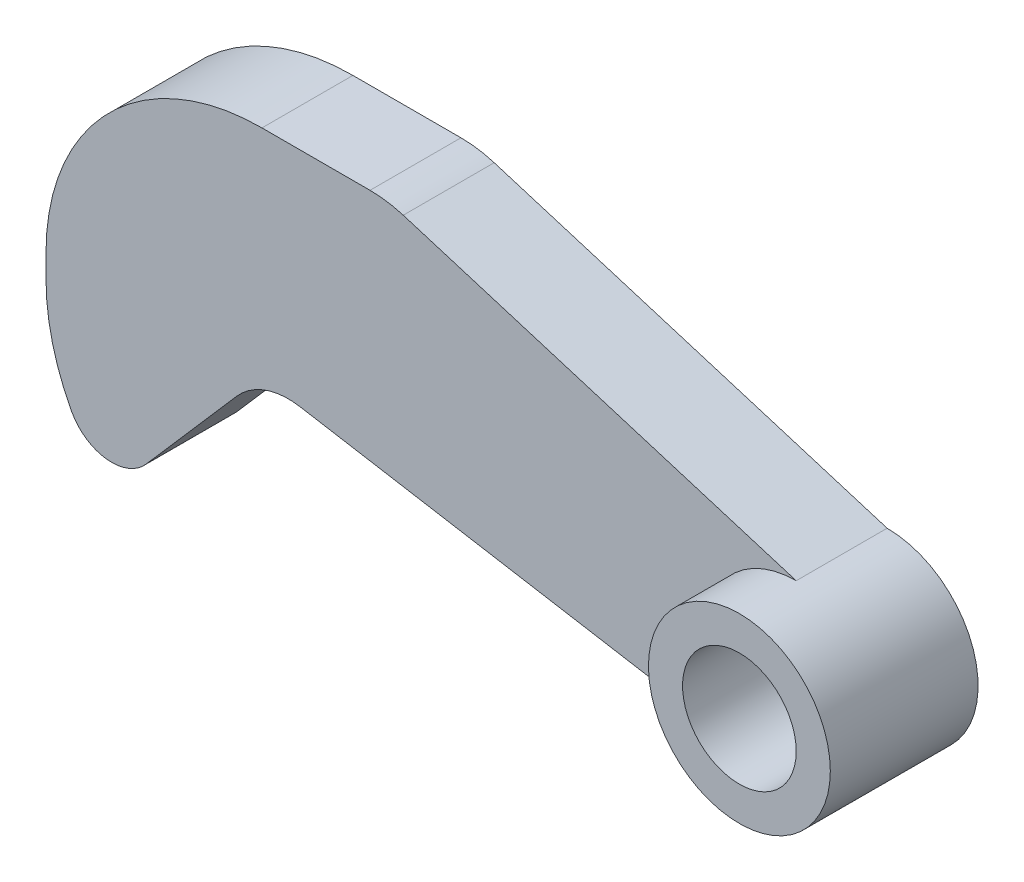
ISO-10303-21;
HEADER;
FILE_DESCRIPTION(('STEP AP214'),'2;1');
FILE_NAME('part.step','',(''),(''),'','','');
FILE_SCHEMA(('AUTOMOTIVE_DESIGN { 1 0 10303 214 1 1 1 1 }'));
ENDSEC;
DATA;
#1=APPLICATION_CONTEXT('core data for automotive mechanical design processes');
#2=APPLICATION_PROTOCOL_DEFINITION('international standard','automotive_design',2000,#1);
#3=PRODUCT_CONTEXT('',#1,'mechanical');
#4=PRODUCT('Part','Part','',(#3));
#5=PRODUCT_RELATED_PRODUCT_CATEGORY('part','',(#4));
#6=PRODUCT_DEFINITION_FORMATION('','',#4);
#7=PRODUCT_DEFINITION_CONTEXT('part definition',#1,'design');
#8=PRODUCT_DEFINITION('design','',#6,#7);
#9=PRODUCT_DEFINITION_SHAPE('','',#8);
#10=(LENGTH_UNIT() NAMED_UNIT(*) SI_UNIT(.MILLI.,.METRE.));
#11=(NAMED_UNIT(*) PLANE_ANGLE_UNIT() SI_UNIT($,.RADIAN.));
#12=(NAMED_UNIT(*) SI_UNIT($,.STERADIAN.) SOLID_ANGLE_UNIT());
#13=UNCERTAINTY_MEASURE_WITH_UNIT(LENGTH_MEASURE(1.E-05),#10,'distance_accuracy_value','');
#14=(GEOMETRIC_REPRESENTATION_CONTEXT(3) GLOBAL_UNCERTAINTY_ASSIGNED_CONTEXT((#13)) GLOBAL_UNIT_ASSIGNED_CONTEXT((#10,
#11,#12)) REPRESENTATION_CONTEXT('',''));
#15=CARTESIAN_POINT('',(0.,0.,0.));
#16=DIRECTION('',(0.,0.,1.));
#17=DIRECTION('',(1.,0.,0.));
#18=AXIS2_PLACEMENT_3D('',#15,#16,#17);
#19=CARTESIAN_POINT('',(25.,0.499999999999999,4.));
#20=DIRECTION('',(0.,0.,-1.));
#21=DIRECTION('',(-1.,0.,0.));
#22=AXIS2_PLACEMENT_3D('',#19,#20,#21);
#23=CYLINDRICAL_SURFACE('',#22,4.);
#24=CARTESIAN_POINT('',(25.,0.499999999999999,0.));
#25=DIRECTION('',(0.,0.,1.));
#26=DIRECTION('',(1.,0.,0.));
#27=AXIS2_PLACEMENT_3D('',#24,#25,#26);
#28=CIRCLE('',#27,4.);
#29=CARTESIAN_POINT('',(23.6766388033441,-3.27474703035655,0.));
#30=VERTEX_POINT('',#29);
#31=CARTESIAN_POINT('',(25.,4.5,0.));
#32=VERTEX_POINT('',#31);
#33=EDGE_CURVE('E151',#30,#32,#28,.T.);
#34=ORIENTED_EDGE('',*,*,#33,.T.);
#35=DIRECTION('',(0.,0.,-1.));
#36=VECTOR('',#35,1.);
#37=CARTESIAN_POINT('',(25.,4.5,4.));
#38=LINE('',#37,#36);
#39=CARTESIAN_POINT('',(25.,4.5,4.));
#40=VERTEX_POINT('',#39);
#41=EDGE_CURVE('E11',#40,#32,#38,.T.);
#42=ORIENTED_EDGE('',*,*,#41,.F.);
#43=CARTESIAN_POINT('',(25.,0.499999999999996,4.));
#44=DIRECTION('',(0.,0.,1.));
#45=DIRECTION('',(1.,0.,0.));
#46=AXIS2_PLACEMENT_3D('',#43,#44,#45);
#47=CIRCLE('',#46,4.);
#48=CARTESIAN_POINT('',(23.6766388033441,-3.27474703035655,4.));
#49=VERTEX_POINT('',#48);
#50=EDGE_CURVE('E195',#40,#49,#47,.T.);
#51=ORIENTED_EDGE('',*,*,#50,.T.);
#52=DIRECTION('',(0.,0.,-1.));
#53=VECTOR('',#52,1.);
#54=CARTESIAN_POINT('',(23.6766388033441,-3.27474703035655,4.));
#55=LINE('',#54,#53);
#56=EDGE_CURVE('E147',#49,#30,#55,.T.);
#57=ORIENTED_EDGE('',*,*,#56,.T.);
#58=EDGE_LOOP('',(#34,#42,#51,#57));
#59=FACE_BOUND('',#58,.T.);
#60=CARTESIAN_POINT('',(25.,0.499999999999996,6.5));
#61=DIRECTION('',(0.,0.,1.));
#62=DIRECTION('',(1.,0.,0.));
#63=AXIS2_PLACEMENT_3D('',#60,#61,#62);
#64=CIRCLE('',#63,4.);
#65=CARTESIAN_POINT('',(29.,0.499999999999996,6.5));
#66=VERTEX_POINT('',#65);
#67=EDGE_CURVE('E155',#66,#66,#64,.T.);
#68=ORIENTED_EDGE('',*,*,#67,.F.);
#69=EDGE_LOOP('',(#68));
#70=FACE_BOUND('',#69,.T.);
#71=ADVANCED_FACE('F35',(#59,#70),#23,.T.);
#72=CARTESIAN_POINT('',(3.3923782639379,11.1023288637968,4.));
#73=DIRECTION('',(-0.29221853559902,-0.956351571051339,0.));
#74=DIRECTION('',(0.956351571051339,-0.29221853559902,0.));
#75=AXIS2_PLACEMENT_3D('',#72,#73,#74);
#76=PLANE('',#75);
#77=DIRECTION('',(-0.956351571051339,0.29221853559902,0.));
#78=VECTOR('',#77,1.);
#79=CARTESIAN_POINT('',(3.3923782639379,11.1023288637968,0.));
#80=LINE('',#79,#78);
#81=CARTESIAN_POINT('',(7.71424701915991,9.78175785525669,0.));
#82=VERTEX_POINT('',#81);
#83=EDGE_CURVE('E154',#32,#82,#80,.T.);
#84=ORIENTED_EDGE('',*,*,#83,.T.);
#85=DIRECTION('',(0.,0.,-1.));
#86=VECTOR('',#85,1.);
#87=CARTESIAN_POINT('',(7.71424701915991,9.78175785525669,4.));
#88=LINE('',#87,#86);
#89=CARTESIAN_POINT('',(7.71424701915991,9.78175785525669,4.));
#90=VERTEX_POINT('',#89);
#91=EDGE_CURVE('E44',#90,#82,#88,.T.);
#92=ORIENTED_EDGE('',*,*,#91,.F.);
#93=DIRECTION('',(-0.956351571051339,0.29221853559902,0.));
#94=VECTOR('',#93,1.);
#95=CARTESIAN_POINT('',(3.3923782639379,11.1023288637968,4.));
#96=LINE('',#95,#94);
#97=EDGE_CURVE('E105',#40,#90,#96,.T.);
#98=ORIENTED_EDGE('',*,*,#97,.F.);
#99=ORIENTED_EDGE('',*,*,#41,.T.);
#100=EDGE_LOOP('',(#84,#92,#98,#99));
#101=FACE_BOUND('',#100,.T.);
#102=ADVANCED_FACE('F242',(#101),#76,.F.);
#103=CARTESIAN_POINT('',(6.25315434116481,5.,4.));
#104=DIRECTION('',(0.,0.,-1.));
#105=DIRECTION('',(-1.,0.,0.));
#106=AXIS2_PLACEMENT_3D('',#103,#104,#105);
#107=CYLINDRICAL_SURFACE('',#106,5.);
#108=CARTESIAN_POINT('',(6.25315434116481,5.,0.));
#109=DIRECTION('',(0.,0.,1.));
#110=DIRECTION('',(1.,0.,0.));
#111=AXIS2_PLACEMENT_3D('',#108,#109,#110);
#112=CIRCLE('',#111,5.);
#113=CARTESIAN_POINT('',(6.25315434116481,10.,0.));
#114=VERTEX_POINT('',#113);
#115=EDGE_CURVE('E158',#114,#82,#112,.F.);
#116=ORIENTED_EDGE('',*,*,#115,.F.);
#117=DIRECTION('',(0.,0.,-1.));
#118=VECTOR('',#117,1.);
#119=CARTESIAN_POINT('',(6.25315434116481,10.,4.));
#120=LINE('',#119,#118);
#121=CARTESIAN_POINT('',(6.25315434116481,10.,4.));
#122=VERTEX_POINT('',#121);
#123=EDGE_CURVE('E189',#122,#114,#120,.T.);
#124=ORIENTED_EDGE('',*,*,#123,.F.);
#125=CARTESIAN_POINT('',(6.25315434116481,5.,4.));
#126=DIRECTION('',(0.,0.,1.));
#127=DIRECTION('',(1.,0.,0.));
#128=AXIS2_PLACEMENT_3D('',#125,#126,#127);
#129=CIRCLE('',#128,5.);
#130=EDGE_CURVE('E201',#122,#90,#129,.F.);
#131=ORIENTED_EDGE('',*,*,#130,.T.);
#132=ORIENTED_EDGE('',*,*,#91,.T.);
#133=EDGE_LOOP('',(#116,#124,#131,#132));
#134=FACE_BOUND('',#133,.T.);
#135=ADVANCED_FACE('F246',(#134),#107,.T.);
#136=CARTESIAN_POINT('',(0.,10.,4.));
#137=DIRECTION('',(0.,1.,0.));
#138=DIRECTION('',(-1.,0.,0.));
#139=AXIS2_PLACEMENT_3D('',#136,#137,#138);
#140=PLANE('',#139);
#141=DIRECTION('',(1.,0.,0.));
#142=VECTOR('',#141,1.);
#143=CARTESIAN_POINT('',(0.,10.,0.));
#144=LINE('',#143,#142);
#145=CARTESIAN_POINT('',(1.5,10.,0.));
#146=VERTEX_POINT('',#145);
#147=EDGE_CURVE('E161',#146,#114,#144,.T.);
#148=ORIENTED_EDGE('',*,*,#147,.F.);
#149=DIRECTION('',(0.,0.,-1.));
#150=VECTOR('',#149,1.);
#151=CARTESIAN_POINT('',(1.5,10.,4.));
#152=LINE('',#151,#150);
#153=CARTESIAN_POINT('',(1.5,10.,4.));
#154=VERTEX_POINT('',#153);
#155=EDGE_CURVE('E187',#154,#146,#152,.T.);
#156=ORIENTED_EDGE('',*,*,#155,.F.);
#157=DIRECTION('',(1.,0.,0.));
#158=VECTOR('',#157,1.);
#159=CARTESIAN_POINT('',(0.,10.,4.));
#160=LINE('',#159,#158);
#161=EDGE_CURVE('E204',#154,#122,#160,.T.);
#162=ORIENTED_EDGE('',*,*,#161,.T.);
#163=ORIENTED_EDGE('',*,*,#123,.T.);
#164=EDGE_LOOP('',(#148,#156,#162,#163));
#165=FACE_BOUND('',#164,.T.);
#166=ADVANCED_FACE('F251',(#165),#140,.T.);
#167=CARTESIAN_POINT('',(1.5,0.499999999999999,4.));
#168=DIRECTION('',(0.,0.,-1.));
#169=DIRECTION('',(-1.,0.,0.));
#170=AXIS2_PLACEMENT_3D('',#167,#168,#169);
#171=CYLINDRICAL_SURFACE('',#170,9.5);
#172=CARTESIAN_POINT('',(1.5,0.499999999999999,0.));
#173=DIRECTION('',(0.,0.,1.));
#174=DIRECTION('',(1.,0.,0.));
#175=AXIS2_PLACEMENT_3D('',#172,#173,#174);
#176=CIRCLE('',#175,9.5);
#177=CARTESIAN_POINT('',(-8.,0.499999999999999,0.));
#178=VERTEX_POINT('',#177);
#179=EDGE_CURVE('E164',#178,#146,#176,.F.);
#180=ORIENTED_EDGE('',*,*,#179,.F.);
#181=DIRECTION('',(0.,0.,-1.));
#182=VECTOR('',#181,1.);
#183=CARTESIAN_POINT('',(-8.,0.499999999999999,4.));
#184=LINE('',#183,#182);
#185=CARTESIAN_POINT('',(-8.,0.499999999999999,4.));
#186=VERTEX_POINT('',#185);
#187=EDGE_CURVE('E185',#186,#178,#184,.T.);
#188=ORIENTED_EDGE('',*,*,#187,.F.);
#189=CARTESIAN_POINT('',(1.5,0.499999999999999,4.));
#190=DIRECTION('',(0.,0.,1.));
#191=DIRECTION('',(1.,0.,0.));
#192=AXIS2_PLACEMENT_3D('',#189,#190,#191);
#193=CIRCLE('',#192,9.5);
#194=EDGE_CURVE('E207',#186,#154,#193,.F.);
#195=ORIENTED_EDGE('',*,*,#194,.T.);
#196=ORIENTED_EDGE('',*,*,#155,.T.);
#197=EDGE_LOOP('',(#180,#188,#195,#196));
#198=FACE_BOUND('',#197,.T.);
#199=ADVANCED_FACE('F257',(#198),#171,.T.);
#200=CARTESIAN_POINT('',(-8.,0.,4.));
#201=DIRECTION('',(-1.,0.,0.));
#202=DIRECTION('',(0.,0.,1.));
#203=AXIS2_PLACEMENT_3D('',#200,#201,#202);
#204=PLANE('',#203);
#205=DIRECTION('',(0.,1.,0.));
#206=VECTOR('',#205,1.);
#207=CARTESIAN_POINT('',(-8.,0.,0.));
#208=LINE('',#207,#206);
#209=CARTESIAN_POINT('',(-8.,-0.500000000000004,0.));
#210=VERTEX_POINT('',#209);
#211=EDGE_CURVE('E167',#210,#178,#208,.T.);
#212=ORIENTED_EDGE('',*,*,#211,.F.);
#213=DIRECTION('',(0.,0.,-1.));
#214=VECTOR('',#213,1.);
#215=CARTESIAN_POINT('',(-8.,-0.500000000000004,4.));
#216=LINE('',#215,#214);
#217=CARTESIAN_POINT('',(-8.,-0.500000000000004,4.));
#218=VERTEX_POINT('',#217);
#219=EDGE_CURVE('E183',#218,#210,#216,.T.);
#220=ORIENTED_EDGE('',*,*,#219,.F.);
#221=DIRECTION('',(0.,1.,0.));
#222=VECTOR('',#221,1.);
#223=CARTESIAN_POINT('',(-8.,0.,4.));
#224=LINE('',#223,#222);
#225=EDGE_CURVE('E210',#218,#186,#224,.T.);
#226=ORIENTED_EDGE('',*,*,#225,.T.);
#227=ORIENTED_EDGE('',*,*,#187,.T.);
#228=EDGE_LOOP('',(#212,#220,#226,#227));
#229=FACE_BOUND('',#228,.T.);
#230=ADVANCED_FACE('F261',(#229),#204,.T.);
#231=CARTESIAN_POINT('',(1.5,-0.500000000000004,4.));
#232=DIRECTION('',(0.,0.,-1.));
#233=DIRECTION('',(-1.,0.,0.));
#234=AXIS2_PLACEMENT_3D('',#231,#232,#233);
#235=CYLINDRICAL_SURFACE('',#234,9.5);
#236=CARTESIAN_POINT('',(1.5,-0.500000000000004,0.));
#237=DIRECTION('',(0.,0.,1.));
#238=DIRECTION('',(1.,0.,0.));
#239=AXIS2_PLACEMENT_3D('',#236,#237,#238);
#240=CIRCLE('',#239,9.5);
#241=CARTESIAN_POINT('',(-6.87096620528538,-4.99187319388806,0.));
#242=VERTEX_POINT('',#241);
#243=EDGE_CURVE('E170',#242,#210,#240,.F.);
#244=ORIENTED_EDGE('',*,*,#243,.F.);
#245=DIRECTION('',(0.,0.,-1.));
#246=VECTOR('',#245,1.);
#247=CARTESIAN_POINT('',(-6.87096620528538,-4.99187319388806,4.));
#248=LINE('',#247,#246);
#249=CARTESIAN_POINT('',(-6.87096620528538,-4.99187319388806,4.));
#250=VERTEX_POINT('',#249);
#251=EDGE_CURVE('E181',#250,#242,#248,.T.);
#252=ORIENTED_EDGE('',*,*,#251,.F.);
#253=CARTESIAN_POINT('',(1.5,-0.500000000000004,4.));
#254=DIRECTION('',(0.,0.,1.));
#255=DIRECTION('',(1.,0.,0.));
#256=AXIS2_PLACEMENT_3D('',#253,#254,#255);
#257=CIRCLE('',#256,9.5);
#258=EDGE_CURVE('E213',#250,#218,#257,.F.);
#259=ORIENTED_EDGE('',*,*,#258,.T.);
#260=ORIENTED_EDGE('',*,*,#219,.T.);
#261=EDGE_LOOP('',(#244,#252,#259,#260));
#262=FACE_BOUND('',#261,.T.);
#263=ADVANCED_FACE('F265',(#262),#235,.T.);
#264=CARTESIAN_POINT('',(-5.10865753048846,-4.04621567938531,4.));
#265=DIRECTION('',(0.,0.,-1.));
#266=DIRECTION('',(-1.,0.,0.));
#267=AXIS2_PLACEMENT_3D('',#264,#265,#266);
#268=CYLINDRICAL_SURFACE('',#267,2.);
#269=CARTESIAN_POINT('',(-5.10865753048846,-4.04621567938531,0.));
#270=DIRECTION('',(0.,0.,1.));
#271=DIRECTION('',(1.,0.,0.));
#272=AXIS2_PLACEMENT_3D('',#269,#270,#271);
#273=CIRCLE('',#272,2.);
#274=CARTESIAN_POINT('',(-3.60008860757994,-5.35931118422669,0.));
#275=VERTEX_POINT('',#274);
#276=EDGE_CURVE('E173',#275,#242,#273,.F.);
#277=ORIENTED_EDGE('',*,*,#276,.F.);
#278=DIRECTION('',(0.,0.,-1.));
#279=VECTOR('',#278,1.);
#280=CARTESIAN_POINT('',(-3.60008860757994,-5.35931118422669,4.));
#281=LINE('',#280,#279);
#282=CARTESIAN_POINT('',(-3.60008860757994,-5.35931118422669,4.));
#283=VERTEX_POINT('',#282);
#284=EDGE_CURVE('E142',#283,#275,#281,.T.);
#285=ORIENTED_EDGE('',*,*,#284,.F.);
#286=CARTESIAN_POINT('',(-5.10865753048846,-4.04621567938531,4.));
#287=DIRECTION('',(0.,0.,1.));
#288=DIRECTION('',(1.,0.,0.));
#289=AXIS2_PLACEMENT_3D('',#286,#287,#288);
#290=CIRCLE('',#289,2.);
#291=EDGE_CURVE('E135',#283,#250,#290,.F.);
#292=ORIENTED_EDGE('',*,*,#291,.T.);
#293=ORIENTED_EDGE('',*,*,#251,.T.);
#294=EDGE_LOOP('',(#277,#285,#292,#293));
#295=FACE_BOUND('',#294,.T.);
#296=ADVANCED_FACE('F217',(#295),#268,.T.);
#297=CARTESIAN_POINT('',(0.605805689260192,-0.527308176176137,4.));
#298=DIRECTION('',(-0.754284461454259,0.656547752420689,0.));
#299=DIRECTION('',(-0.656547752420689,-0.754284461454259,0.));
#300=AXIS2_PLACEMENT_3D('',#297,#298,#299);
#301=PLANE('',#300);
#302=DIRECTION('',(0.656547752420689,0.754284461454259,0.));
#303=VECTOR('',#302,1.);
#304=CARTESIAN_POINT('',(0.605805689260192,-0.527308176176137,0.));
#305=LINE('',#304,#303);
#306=CARTESIAN_POINT('',(0.394172841763696,-0.770445659796126,0.));
#307=VERTEX_POINT('',#306);
#308=EDGE_CURVE('E141',#275,#307,#305,.T.);
#309=ORIENTED_EDGE('',*,*,#308,.T.);
#310=DIRECTION('',(0.,0.,-1.));
#311=VECTOR('',#310,1.);
#312=CARTESIAN_POINT('',(0.394172841763696,-0.770445659796126,4.));
#313=LINE('',#312,#311);
#314=CARTESIAN_POINT('',(0.394172841763696,-0.770445659796126,4.));
#315=VERTEX_POINT('',#314);
#316=EDGE_CURVE('E138',#315,#307,#313,.T.);
#317=ORIENTED_EDGE('',*,*,#316,.F.);
#318=DIRECTION('',(0.656547752420689,0.754284461454259,0.));
#319=VECTOR('',#318,1.);
#320=CARTESIAN_POINT('',(0.605805689260192,-0.527308176176137,4.));
#321=LINE('',#320,#319);
#322=EDGE_CURVE('E128',#283,#315,#321,.T.);
#323=ORIENTED_EDGE('',*,*,#322,.F.);
#324=ORIENTED_EDGE('',*,*,#284,.T.);
#325=EDGE_LOOP('',(#309,#317,#323,#324));
#326=FACE_BOUND('',#325,.T.);
#327=ADVANCED_FACE('F139',(#326),#301,.F.);
#328=CARTESIAN_POINT('',(2.65702622612648,-2.74008891705818,4.));
#329=DIRECTION('',(0.,0.,-1.));
#330=DIRECTION('',(-1.,0.,0.));
#331=AXIS2_PLACEMENT_3D('',#328,#329,#330);
#332=CYLINDRICAL_SURFACE('',#331,3.);
#333=CARTESIAN_POINT('',(2.65702622612648,-2.74008891705818,0.));
#334=DIRECTION('',(0.,0.,1.));
#335=DIRECTION('',(1.,0.,0.));
#336=AXIS2_PLACEMENT_3D('',#333,#334,#335);
#337=CIRCLE('',#336,3.);
#338=CARTESIAN_POINT('',(3.16042427027158,0.217374592294197,0.));
#339=VERTEX_POINT('',#338);
#340=EDGE_CURVE('E92',#307,#339,#337,.F.);
#341=ORIENTED_EDGE('',*,*,#340,.T.);
#342=DIRECTION('',(0.,0.,-1.));
#343=VECTOR('',#342,1.);
#344=CARTESIAN_POINT('',(3.16042427027158,0.217374592294197,4.));
#345=LINE('',#344,#343);
#346=CARTESIAN_POINT('',(3.16042427027158,0.217374592294197,4.));
#347=VERTEX_POINT('',#346);
#348=EDGE_CURVE('E143',#347,#339,#345,.T.);
#349=ORIENTED_EDGE('',*,*,#348,.F.);
#350=CARTESIAN_POINT('',(2.65702622612648,-2.74008891705818,4.));
#351=DIRECTION('',(0.,0.,1.));
#352=DIRECTION('',(1.,0.,0.));
#353=AXIS2_PLACEMENT_3D('',#350,#351,#352);
#354=CIRCLE('',#353,3.);
#355=EDGE_CURVE('E132',#315,#347,#354,.F.);
#356=ORIENTED_EDGE('',*,*,#355,.F.);
#357=ORIENTED_EDGE('',*,*,#316,.T.);
#358=EDGE_LOOP('',(#341,#349,#356,#357));
#359=FACE_BOUND('',#358,.T.);
#360=ADVANCED_FACE('F145',(#359),#332,.F.);
#361=CARTESIAN_POINT('',(0.124945006599214,0.73405191377036,4.));
#362=DIRECTION('',(0.167799348048367,0.985821169784126,0.));
#363=DIRECTION('',(-0.985821169784126,0.167799348048367,0.));
#364=AXIS2_PLACEMENT_3D('',#361,#362,#363);
#365=PLANE('',#364);
#366=DIRECTION('',(0.985821169784126,-0.167799348048367,0.));
#367=VECTOR('',#366,1.);
#368=CARTESIAN_POINT('',(0.124945006599214,0.73405191377036,0.));
#369=LINE('',#368,#367);
#370=EDGE_CURVE('E98',#339,#30,#369,.T.);
#371=ORIENTED_EDGE('',*,*,#370,.T.);
#372=ORIENTED_EDGE('',*,*,#56,.F.);
#373=DIRECTION('',(0.985821169784126,-0.167799348048367,0.));
#374=VECTOR('',#373,1.);
#375=CARTESIAN_POINT('',(0.124945006599214,0.73405191377036,4.));
#376=LINE('',#375,#374);
#377=EDGE_CURVE('E53',#347,#49,#376,.T.);
#378=ORIENTED_EDGE('',*,*,#377,.F.);
#379=ORIENTED_EDGE('',*,*,#348,.T.);
#380=EDGE_LOOP('',(#371,#372,#378,#379));
#381=FACE_BOUND('',#380,.T.);
#382=ADVANCED_FACE('F231',(#381),#365,.F.);
#383=CARTESIAN_POINT('',(0.,0.,4.));
#384=DIRECTION('',(0.,0.,1.));
#385=DIRECTION('',(1.,0.,0.));
#386=AXIS2_PLACEMENT_3D('',#383,#384,#385);
#387=PLANE('',#386);
#388=ORIENTED_EDGE('',*,*,#50,.F.);
#389=ORIENTED_EDGE('',*,*,#97,.T.);
#390=ORIENTED_EDGE('',*,*,#130,.F.);
#391=ORIENTED_EDGE('',*,*,#161,.F.);
#392=ORIENTED_EDGE('',*,*,#194,.F.);
#393=ORIENTED_EDGE('',*,*,#225,.F.);
#394=ORIENTED_EDGE('',*,*,#258,.F.);
#395=ORIENTED_EDGE('',*,*,#291,.F.);
#396=ORIENTED_EDGE('',*,*,#322,.T.);
#397=ORIENTED_EDGE('',*,*,#355,.T.);
#398=ORIENTED_EDGE('',*,*,#377,.T.);
#399=EDGE_LOOP('',(#388,#389,#390,#391,#392,#393,#394,#395,#396,#397,#398));
#400=FACE_BOUND('',#399,.T.);
#401=ADVANCED_FACE('F130',(#400),#387,.T.);
#402=CARTESIAN_POINT('',(0.,0.,0.));
#403=DIRECTION('',(0.,0.,1.));
#404=DIRECTION('',(1.,0.,0.));
#405=AXIS2_PLACEMENT_3D('',#402,#403,#404);
#406=PLANE('',#405);
#407=ORIENTED_EDGE('',*,*,#33,.F.);
#408=ORIENTED_EDGE('',*,*,#370,.F.);
#409=ORIENTED_EDGE('',*,*,#340,.F.);
#410=ORIENTED_EDGE('',*,*,#308,.F.);
#411=ORIENTED_EDGE('',*,*,#276,.T.);
#412=ORIENTED_EDGE('',*,*,#243,.T.);
#413=ORIENTED_EDGE('',*,*,#211,.T.);
#414=ORIENTED_EDGE('',*,*,#179,.T.);
#415=ORIENTED_EDGE('',*,*,#147,.T.);
#416=ORIENTED_EDGE('',*,*,#115,.T.);
#417=ORIENTED_EDGE('',*,*,#83,.F.);
#418=EDGE_LOOP('',(#407,#408,#409,#410,#411,#412,#413,#414,#415,#416,#417));
#419=FACE_BOUND('',#418,.T.);
#420=ADVANCED_FACE('F221',(#419),#406,.F.);
#421=CARTESIAN_POINT('',(25.,0.499999999999996,6.5));
#422=DIRECTION('',(0.,0.,1.));
#423=DIRECTION('',(1.,0.,0.));
#424=AXIS2_PLACEMENT_3D('',#421,#422,#423);
#425=PLANE('',#424);
#426=CARTESIAN_POINT('',(25.,0.499999999999999,6.5));
#427=DIRECTION('',(0.,0.,1.));
#428=DIRECTION('',(1.,0.,0.));
#429=AXIS2_PLACEMENT_3D('',#426,#427,#428);
#430=CIRCLE('',#429,2.5);
#431=CARTESIAN_POINT('',(27.5,0.499999999999999,6.5));
#432=VERTEX_POINT('',#431);
#433=EDGE_CURVE('E346',#432,#432,#430,.T.);
#434=ORIENTED_EDGE('',*,*,#433,.F.);
#435=EDGE_LOOP('',(#434));
#436=FACE_BOUND('',#435,.T.);
#437=ORIENTED_EDGE('',*,*,#67,.T.);
#438=EDGE_LOOP('',(#437));
#439=FACE_BOUND('',#438,.T.);
#440=ADVANCED_FACE('F290',(#436,#439),#425,.T.);
#441=CARTESIAN_POINT('',(25.,0.499999999999999,1.));
#442=DIRECTION('',(0.,0.,1.));
#443=DIRECTION('',(1.,0.,0.));
#444=AXIS2_PLACEMENT_3D('',#441,#442,#443);
#445=CYLINDRICAL_SURFACE('',#444,2.5);
#446=CARTESIAN_POINT('',(25.,0.499999999999999,1.));
#447=DIRECTION('',(0.,0.,1.));
#448=DIRECTION('',(1.,0.,0.));
#449=AXIS2_PLACEMENT_3D('',#446,#447,#448);
#450=CIRCLE('',#449,2.5);
#451=CARTESIAN_POINT('',(27.5,0.499999999999999,1.));
#452=VERTEX_POINT('',#451);
#453=EDGE_CURVE('E199',#452,#452,#450,.T.);
#454=ORIENTED_EDGE('',*,*,#453,.F.);
#455=EDGE_LOOP('',(#454));
#456=FACE_BOUND('',#455,.T.);
#457=ORIENTED_EDGE('',*,*,#433,.T.);
#458=EDGE_LOOP('',(#457));
#459=FACE_BOUND('',#458,.T.);
#460=ADVANCED_FACE('F320',(#456,#459),#445,.F.);
#461=CARTESIAN_POINT('',(25.,0.499999999999999,1.));
#462=DIRECTION('',(0.,0.,1.));
#463=DIRECTION('',(1.,0.,0.));
#464=AXIS2_PLACEMENT_3D('',#461,#462,#463);
#465=PLANE('',#464);
#466=ORIENTED_EDGE('',*,*,#453,.T.);
#467=EDGE_LOOP('',(#466));
#468=FACE_BOUND('',#467,.T.);
#469=ADVANCED_FACE('F330',(#468),#465,.T.);
#470=CLOSED_SHELL('',(#71,#102,#135,#166,#199,#230,#263,#296,#327,#360,#382,#401,#420,#440,#460,#469));
#471=MANIFOLD_SOLID_BREP('B2',#470);
#472=ADVANCED_BREP_SHAPE_REPRESENTATION('',(#18,#471),#14);
#473=SHAPE_DEFINITION_REPRESENTATION(#9,#472);
ENDSEC;
END-ISO-10303-21;
